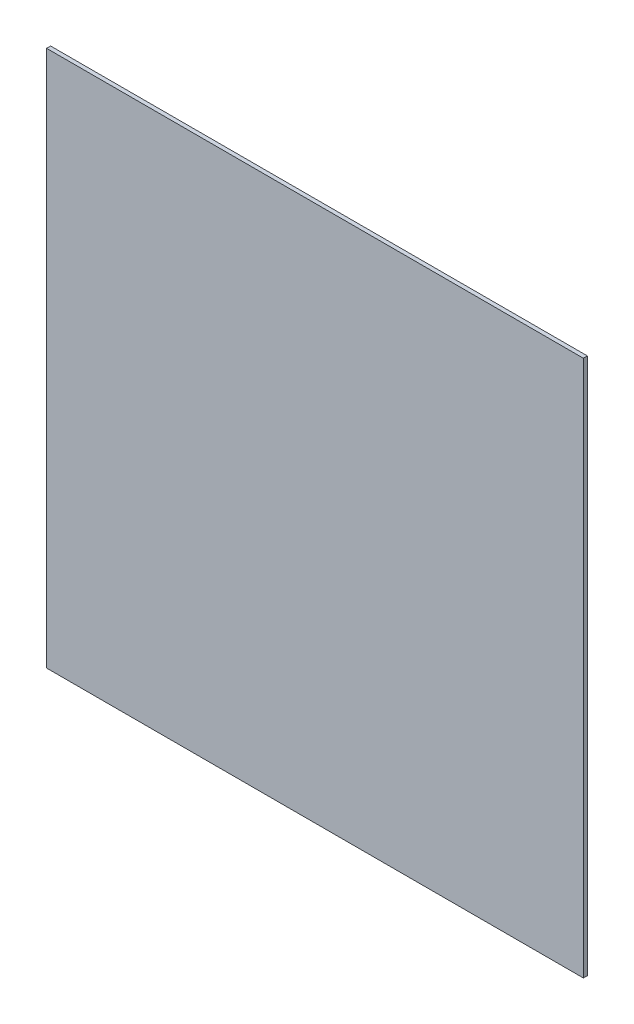
ISO-10303-21;
HEADER;
FILE_DESCRIPTION(('STEP AP214'),'2;1');
FILE_NAME('part.step','',(''),(''),'','','');
FILE_SCHEMA(('AUTOMOTIVE_DESIGN { 1 0 10303 214 1 1 1 1 }'));
ENDSEC;
DATA;
#1=APPLICATION_CONTEXT('core data for automotive mechanical design processes');
#2=APPLICATION_PROTOCOL_DEFINITION('international standard','automotive_design',2000,#1);
#3=PRODUCT_CONTEXT('',#1,'mechanical');
#4=PRODUCT('Part','Part','',(#3));
#5=PRODUCT_RELATED_PRODUCT_CATEGORY('part','',(#4));
#6=PRODUCT_DEFINITION_FORMATION('','',#4);
#7=PRODUCT_DEFINITION_CONTEXT('part definition',#1,'design');
#8=PRODUCT_DEFINITION('design','',#6,#7);
#9=PRODUCT_DEFINITION_SHAPE('','',#8);
#10=(LENGTH_UNIT() NAMED_UNIT(*) SI_UNIT(.MILLI.,.METRE.));
#11=(NAMED_UNIT(*) PLANE_ANGLE_UNIT() SI_UNIT($,.RADIAN.));
#12=(NAMED_UNIT(*) SI_UNIT($,.STERADIAN.) SOLID_ANGLE_UNIT());
#13=UNCERTAINTY_MEASURE_WITH_UNIT(LENGTH_MEASURE(1.E-05),#10,'distance_accuracy_value','');
#14=(GEOMETRIC_REPRESENTATION_CONTEXT(3) GLOBAL_UNCERTAINTY_ASSIGNED_CONTEXT((#13)) GLOBAL_UNIT_ASSIGNED_CONTEXT((#10,
#11,#12)) REPRESENTATION_CONTEXT('',''));
#15=CARTESIAN_POINT('',(0.,0.,0.));
#16=DIRECTION('',(0.,0.,1.));
#17=DIRECTION('',(1.,0.,0.));
#18=AXIS2_PLACEMENT_3D('',#15,#16,#17);
#19=CARTESIAN_POINT('',(0.,0.,-0.3));
#20=DIRECTION('',(-1.,0.,0.));
#21=DIRECTION('',(0.,0.,1.));
#22=AXIS2_PLACEMENT_3D('',#19,#20,#21);
#23=PLANE('',#22);
#24=DIRECTION('',(0.,-1.,0.));
#25=VECTOR('',#24,1.);
#26=CARTESIAN_POINT('',(0.,0.,0.));
#27=LINE('',#26,#25);
#28=CARTESIAN_POINT('',(0.,40.,0.));
#29=VERTEX_POINT('',#28);
#30=CARTESIAN_POINT('',(0.,0.,0.));
#31=VERTEX_POINT('',#30);
#32=EDGE_CURVE('E80',#29,#31,#27,.T.);
#33=ORIENTED_EDGE('',*,*,#32,.F.);
#34=DIRECTION('',(0.,0.,1.));
#35=VECTOR('',#34,1.);
#36=CARTESIAN_POINT('',(0.,40.,-0.3));
#37=LINE('',#36,#35);
#38=CARTESIAN_POINT('',(0.,40.,-0.3));
#39=VERTEX_POINT('',#38);
#40=EDGE_CURVE('E11',#39,#29,#37,.T.);
#41=ORIENTED_EDGE('',*,*,#40,.F.);
#42=DIRECTION('',(0.,-1.,0.));
#43=VECTOR('',#42,1.);
#44=CARTESIAN_POINT('',(0.,0.,-0.3));
#45=LINE('',#44,#43);
#46=CARTESIAN_POINT('',(0.,0.,-0.3));
#47=VERTEX_POINT('',#46);
#48=EDGE_CURVE('E82',#39,#47,#45,.T.);
#49=ORIENTED_EDGE('',*,*,#48,.T.);
#50=DIRECTION('',(0.,0.,1.));
#51=VECTOR('',#50,1.);
#52=CARTESIAN_POINT('',(0.,0.,-0.3));
#53=LINE('',#52,#51);
#54=EDGE_CURVE('E43',#47,#31,#53,.T.);
#55=ORIENTED_EDGE('',*,*,#54,.T.);
#56=EDGE_LOOP('',(#33,#41,#49,#55));
#57=FACE_BOUND('',#56,.T.);
#58=ADVANCED_FACE('F40',(#57),#23,.T.);
#59=CARTESIAN_POINT('',(0.,40.,-0.3));
#60=DIRECTION('',(0.,1.,0.));
#61=DIRECTION('',(0.,0.,1.));
#62=AXIS2_PLACEMENT_3D('',#59,#60,#61);
#63=PLANE('',#62);
#64=DIRECTION('',(-1.,0.,0.));
#65=VECTOR('',#64,1.);
#66=CARTESIAN_POINT('',(0.,40.,0.));
#67=LINE('',#66,#65);
#68=CARTESIAN_POINT('',(40.,40.,0.));
#69=VERTEX_POINT('',#68);
#70=EDGE_CURVE('E98',#69,#29,#67,.T.);
#71=ORIENTED_EDGE('',*,*,#70,.F.);
#72=DIRECTION('',(0.,0.,1.));
#73=VECTOR('',#72,1.);
#74=CARTESIAN_POINT('',(40.,40.,-0.3));
#75=LINE('',#74,#73);
#76=CARTESIAN_POINT('',(40.,40.,-0.3));
#77=VERTEX_POINT('',#76);
#78=EDGE_CURVE('E48',#77,#69,#75,.T.);
#79=ORIENTED_EDGE('',*,*,#78,.F.);
#80=DIRECTION('',(-1.,0.,0.));
#81=VECTOR('',#80,1.);
#82=CARTESIAN_POINT('',(0.,40.,-0.3));
#83=LINE('',#82,#81);
#84=EDGE_CURVE('E87',#77,#39,#83,.T.);
#85=ORIENTED_EDGE('',*,*,#84,.T.);
#86=ORIENTED_EDGE('',*,*,#40,.T.);
#87=EDGE_LOOP('',(#71,#79,#85,#86));
#88=FACE_BOUND('',#87,.T.);
#89=ADVANCED_FACE('F118',(#88),#63,.T.);
#90=CARTESIAN_POINT('',(40.,0.,-0.3));
#91=DIRECTION('',(1.,0.,0.));
#92=DIRECTION('',(0.,1.,0.));
#93=AXIS2_PLACEMENT_3D('',#90,#91,#92);
#94=PLANE('',#93);
#95=DIRECTION('',(0.,1.,0.));
#96=VECTOR('',#95,1.);
#97=CARTESIAN_POINT('',(40.,0.,0.));
#98=LINE('',#97,#96);
#99=CARTESIAN_POINT('',(40.,0.,0.));
#100=VERTEX_POINT('',#99);
#101=EDGE_CURVE('E95',#100,#69,#98,.T.);
#102=ORIENTED_EDGE('',*,*,#101,.F.);
#103=DIRECTION('',(0.,0.,1.));
#104=VECTOR('',#103,1.);
#105=CARTESIAN_POINT('',(40.,0.,-0.3));
#106=LINE('',#105,#104);
#107=CARTESIAN_POINT('',(40.,0.,-0.3));
#108=VERTEX_POINT('',#107);
#109=EDGE_CURVE('E86',#108,#100,#106,.T.);
#110=ORIENTED_EDGE('',*,*,#109,.F.);
#111=DIRECTION('',(0.,1.,0.));
#112=VECTOR('',#111,1.);
#113=CARTESIAN_POINT('',(40.,0.,-0.3));
#114=LINE('',#113,#112);
#115=EDGE_CURVE('E111',#108,#77,#114,.T.);
#116=ORIENTED_EDGE('',*,*,#115,.T.);
#117=ORIENTED_EDGE('',*,*,#78,.T.);
#118=EDGE_LOOP('',(#102,#110,#116,#117));
#119=FACE_BOUND('',#118,.T.);
#120=ADVANCED_FACE('F115',(#119),#94,.T.);
#121=CARTESIAN_POINT('',(0.,0.,-0.3));
#122=DIRECTION('',(0.,-1.,0.));
#123=DIRECTION('',(0.,0.,-1.));
#124=AXIS2_PLACEMENT_3D('',#121,#122,#123);
#125=PLANE('',#124);
#126=DIRECTION('',(1.,0.,0.));
#127=VECTOR('',#126,1.);
#128=CARTESIAN_POINT('',(0.,0.,0.));
#129=LINE('',#128,#127);
#130=EDGE_CURVE('E89',#31,#100,#129,.T.);
#131=ORIENTED_EDGE('',*,*,#130,.F.);
#132=ORIENTED_EDGE('',*,*,#54,.F.);
#133=DIRECTION('',(1.,0.,0.));
#134=VECTOR('',#133,1.);
#135=CARTESIAN_POINT('',(0.,0.,-0.3));
#136=LINE('',#135,#134);
#137=EDGE_CURVE('E109',#47,#108,#136,.T.);
#138=ORIENTED_EDGE('',*,*,#137,.T.);
#139=ORIENTED_EDGE('',*,*,#109,.T.);
#140=EDGE_LOOP('',(#131,#132,#138,#139));
#141=FACE_BOUND('',#140,.T.);
#142=ADVANCED_FACE('F90',(#141),#125,.T.);
#143=CARTESIAN_POINT('',(0.,40.,-0.3));
#144=DIRECTION('',(0.,0.,-1.));
#145=DIRECTION('',(-1.,0.,0.));
#146=AXIS2_PLACEMENT_3D('',#143,#144,#145);
#147=PLANE('',#146);
#148=ORIENTED_EDGE('',*,*,#48,.F.);
#149=ORIENTED_EDGE('',*,*,#84,.F.);
#150=ORIENTED_EDGE('',*,*,#115,.F.);
#151=ORIENTED_EDGE('',*,*,#137,.F.);
#152=EDGE_LOOP('',(#148,#149,#150,#151));
#153=FACE_BOUND('',#152,.T.);
#154=ADVANCED_FACE('F120',(#153),#147,.T.);
#155=CARTESIAN_POINT('',(0.,40.,0.));
#156=DIRECTION('',(0.,0.,-1.));
#157=DIRECTION('',(-1.,0.,0.));
#158=AXIS2_PLACEMENT_3D('',#155,#156,#157);
#159=PLANE('',#158);
#160=ORIENTED_EDGE('',*,*,#32,.T.);
#161=ORIENTED_EDGE('',*,*,#130,.T.);
#162=ORIENTED_EDGE('',*,*,#101,.T.);
#163=ORIENTED_EDGE('',*,*,#70,.T.);
#164=EDGE_LOOP('',(#160,#161,#162,#163));
#165=FACE_BOUND('',#164,.T.);
#166=ADVANCED_FACE('F97',(#165),#159,.F.);
#167=CLOSED_SHELL('',(#58,#89,#120,#142,#154,#166));
#168=MANIFOLD_SOLID_BREP('B2',#167);
#169=ADVANCED_BREP_SHAPE_REPRESENTATION('',(#18,#168),#14);
#170=SHAPE_DEFINITION_REPRESENTATION(#9,#169);
ENDSEC;
END-ISO-10303-21;
